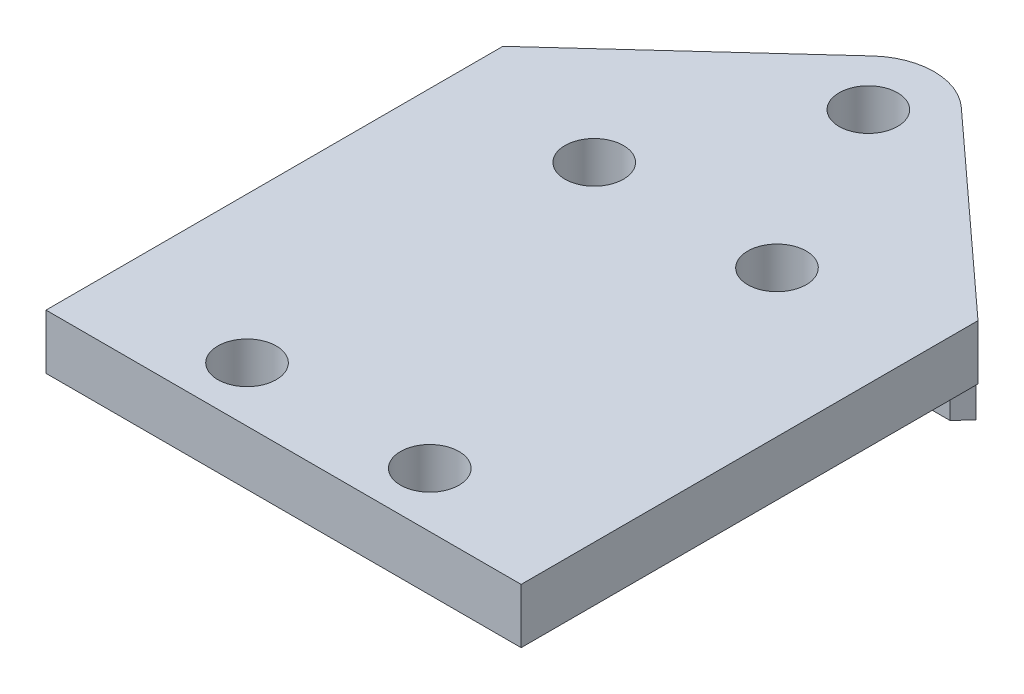
ISO-10303-21;
HEADER;
FILE_DESCRIPTION(('STEP AP214'),'2;1');
FILE_NAME('part.step','',(''),(''),'','','');
FILE_SCHEMA(('AUTOMOTIVE_DESIGN { 1 0 10303 214 1 1 1 1 }'));
ENDSEC;
DATA;
#1=APPLICATION_CONTEXT('core data for automotive mechanical design processes');
#2=APPLICATION_PROTOCOL_DEFINITION('international standard','automotive_design',2000,#1);
#3=PRODUCT_CONTEXT('',#1,'mechanical');
#4=PRODUCT('Part','Part','',(#3));
#5=PRODUCT_RELATED_PRODUCT_CATEGORY('part','',(#4));
#6=PRODUCT_DEFINITION_FORMATION('','',#4);
#7=PRODUCT_DEFINITION_CONTEXT('part definition',#1,'design');
#8=PRODUCT_DEFINITION('design','',#6,#7);
#9=PRODUCT_DEFINITION_SHAPE('','',#8);
#10=(LENGTH_UNIT() NAMED_UNIT(*) SI_UNIT(.MILLI.,.METRE.));
#11=(NAMED_UNIT(*) PLANE_ANGLE_UNIT() SI_UNIT($,.RADIAN.));
#12=(NAMED_UNIT(*) SI_UNIT($,.STERADIAN.) SOLID_ANGLE_UNIT());
#13=UNCERTAINTY_MEASURE_WITH_UNIT(LENGTH_MEASURE(1.E-05),#10,'distance_accuracy_value','');
#14=(GEOMETRIC_REPRESENTATION_CONTEXT(3) GLOBAL_UNCERTAINTY_ASSIGNED_CONTEXT((#13)) GLOBAL_UNIT_ASSIGNED_CONTEXT((#10,
#11,#12)) REPRESENTATION_CONTEXT('',''));
#15=CARTESIAN_POINT('',(0.,0.,0.));
#16=DIRECTION('',(0.,0.,1.));
#17=DIRECTION('',(1.,0.,0.));
#18=AXIS2_PLACEMENT_3D('',#15,#16,#17);
#19=CARTESIAN_POINT('',(13.,0.,-32.));
#20=DIRECTION('',(0.,1.,0.));
#21=DIRECTION('',(0.,0.,1.));
#22=AXIS2_PLACEMENT_3D('',#19,#20,#21);
#23=PLANE('',#22);
#24=CARTESIAN_POINT('',(8.,0.,-3.));
#25=DIRECTION('',(0.,1.,0.));
#26=DIRECTION('',(0.,0.,-1.));
#27=AXIS2_PLACEMENT_3D('',#24,#25,#26);
#28=CIRCLE('',#27,1.6);
#29=CARTESIAN_POINT('',(8.,0.,-4.6));
#30=VERTEX_POINT('',#29);
#31=EDGE_CURVE('E185',#30,#30,#28,.T.);
#32=ORIENTED_EDGE('',*,*,#31,.T.);
#33=EDGE_LOOP('',(#32));
#34=FACE_BOUND('',#33,.T.);
#35=CARTESIAN_POINT('',(18.,0.,-3.));
#36=DIRECTION('',(0.,1.,0.));
#37=DIRECTION('',(0.,0.,1.));
#38=AXIS2_PLACEMENT_3D('',#35,#36,#37);
#39=CIRCLE('',#38,1.6);
#40=CARTESIAN_POINT('',(18.,0.,-1.4));
#41=VERTEX_POINT('',#40);
#42=EDGE_CURVE('E189',#41,#41,#39,.T.);
#43=ORIENTED_EDGE('',*,*,#42,.T.);
#44=EDGE_LOOP('',(#43));
#45=FACE_BOUND('',#44,.T.);
#46=CARTESIAN_POINT('',(18.,0.,-22.));
#47=DIRECTION('',(0.,1.,0.));
#48=DIRECTION('',(0.,0.,-1.));
#49=AXIS2_PLACEMENT_3D('',#46,#47,#48);
#50=CIRCLE('',#49,1.6);
#51=CARTESIAN_POINT('',(18.,0.,-23.6));
#52=VERTEX_POINT('',#51);
#53=EDGE_CURVE('E195',#52,#52,#50,.T.);
#54=ORIENTED_EDGE('',*,*,#53,.T.);
#55=EDGE_LOOP('',(#54));
#56=FACE_BOUND('',#55,.T.);
#57=CARTESIAN_POINT('',(8.,0.,-22.));
#58=DIRECTION('',(0.,1.,0.));
#59=DIRECTION('',(0.,0.,1.));
#60=AXIS2_PLACEMENT_3D('',#57,#58,#59);
#61=CIRCLE('',#60,1.6);
#62=CARTESIAN_POINT('',(8.,0.,-20.4));
#63=VERTEX_POINT('',#62);
#64=EDGE_CURVE('E201',#63,#63,#61,.T.);
#65=ORIENTED_EDGE('',*,*,#64,.T.);
#66=EDGE_LOOP('',(#65));
#67=FACE_BOUND('',#66,.T.);
#68=DIRECTION('',(-0.674470298119938,0.,-0.738301982222723));
#69=VECTOR('',#68,1.);
#70=CARTESIAN_POINT('',(1.35549454233017,0.,-26.2383019822227));
#71=LINE('',#70,#69);
#72=CARTESIAN_POINT('',(2.0299648404501,0.,-25.5));
#73=VERTEX_POINT('',#72);
#74=CARTESIAN_POINT('',(1.35549454233017,0.,-26.2383019822227));
#75=VERTEX_POINT('',#74);
#76=EDGE_CURVE('E58',#73,#75,#71,.T.);
#77=ORIENTED_EDGE('',*,*,#76,.F.);
#78=DIRECTION('',(-1.,0.,0.));
#79=VECTOR('',#78,1.);
#80=CARTESIAN_POINT('',(2.0299648404501,0.,-25.5));
#81=LINE('',#80,#79);
#82=CARTESIAN_POINT('',(23.9700351595499,0.,-25.5));
#83=VERTEX_POINT('',#82);
#84=EDGE_CURVE('E153',#83,#73,#81,.T.);
#85=ORIENTED_EDGE('',*,*,#84,.F.);
#86=DIRECTION('',(-0.674470298119936,0.,0.738301982222725));
#87=VECTOR('',#86,1.);
#88=CARTESIAN_POINT('',(24.6445054576698,0.,-26.2383019822227));
#89=LINE('',#88,#87);
#90=CARTESIAN_POINT('',(24.6445054576698,0.,-26.2383019822227));
#91=VERTEX_POINT('',#90);
#92=EDGE_CURVE('E149',#91,#83,#89,.T.);
#93=ORIENTED_EDGE('',*,*,#92,.F.);
#94=DIRECTION('',(-0.738301982222729,0.,-0.674470298119931));
#95=VECTOR('',#94,1.);
#96=CARTESIAN_POINT('',(26.,0.,-25.));
#97=LINE('',#96,#95);
#98=CARTESIAN_POINT('',(26.,0.,-25.));
#99=VERTEX_POINT('',#98);
#100=EDGE_CURVE('E231',#99,#91,#97,.T.);
#101=ORIENTED_EDGE('',*,*,#100,.F.);
#102=DIRECTION('',(0.,0.,-1.));
#103=VECTOR('',#102,1.);
#104=CARTESIAN_POINT('',(26.,0.,0.));
#105=LINE('',#104,#103);
#106=CARTESIAN_POINT('',(26.,0.,0.));
#107=VERTEX_POINT('',#106);
#108=EDGE_CURVE('E229',#107,#99,#105,.T.);
#109=ORIENTED_EDGE('',*,*,#108,.F.);
#110=DIRECTION('',(1.,0.,0.));
#111=VECTOR('',#110,1.);
#112=CARTESIAN_POINT('',(0.,0.,0.));
#113=LINE('',#112,#111);
#114=CARTESIAN_POINT('',(0.,0.,0.));
#115=VERTEX_POINT('',#114);
#116=EDGE_CURVE('E227',#115,#107,#113,.T.);
#117=ORIENTED_EDGE('',*,*,#116,.F.);
#118=DIRECTION('',(0.,0.,1.));
#119=VECTOR('',#118,1.);
#120=CARTESIAN_POINT('',(0.,0.,0.));
#121=LINE('',#120,#119);
#122=CARTESIAN_POINT('',(0.,0.,-25.));
#123=VERTEX_POINT('',#122);
#124=EDGE_CURVE('E207',#123,#115,#121,.T.);
#125=ORIENTED_EDGE('',*,*,#124,.F.);
#126=DIRECTION('',(-0.738301982222729,0.,0.674470298119931));
#127=VECTOR('',#126,1.);
#128=CARTESIAN_POINT('',(0.,0.,-25.));
#129=LINE('',#128,#127);
#130=EDGE_CURVE('E214',#75,#123,#129,.T.);
#131=ORIENTED_EDGE('',*,*,#130,.F.);
#132=EDGE_LOOP('',(#77,#85,#93,#101,#109,#117,#125,#131));
#133=FACE_BOUND('',#132,.T.);
#134=ADVANCED_FACE('F35',(#34,#45,#56,#67,#133),#23,.F.);
#135=CARTESIAN_POINT('',(13.,3.,-32.));
#136=DIRECTION('',(0.,1.,0.));
#137=DIRECTION('',(0.,0.,1.));
#138=AXIS2_PLACEMENT_3D('',#135,#136,#137);
#139=PLANE('',#138);
#140=CARTESIAN_POINT('',(8.,3.,-3.));
#141=DIRECTION('',(0.,1.,0.));
#142=DIRECTION('',(0.,0.,-1.));
#143=AXIS2_PLACEMENT_3D('',#140,#141,#142);
#144=CIRCLE('',#143,1.6);
#145=CARTESIAN_POINT('',(8.,3.,-4.6));
#146=VERTEX_POINT('',#145);
#147=EDGE_CURVE('E186',#146,#146,#144,.T.);
#148=ORIENTED_EDGE('',*,*,#147,.F.);
#149=EDGE_LOOP('',(#148));
#150=FACE_BOUND('',#149,.T.);
#151=CARTESIAN_POINT('',(18.,3.,-22.));
#152=DIRECTION('',(0.,1.,0.));
#153=DIRECTION('',(0.,0.,-1.));
#154=AXIS2_PLACEMENT_3D('',#151,#152,#153);
#155=CIRCLE('',#154,1.6);
#156=CARTESIAN_POINT('',(18.,3.,-23.6));
#157=VERTEX_POINT('',#156);
#158=EDGE_CURVE('E198',#157,#157,#155,.T.);
#159=ORIENTED_EDGE('',*,*,#158,.F.);
#160=EDGE_LOOP('',(#159));
#161=FACE_BOUND('',#160,.T.);
#162=DIRECTION('',(0.,0.,1.));
#163=VECTOR('',#162,1.);
#164=CARTESIAN_POINT('',(0.,3.,0.));
#165=LINE('',#164,#163);
#166=CARTESIAN_POINT('',(0.,3.,-25.));
#167=VERTEX_POINT('',#166);
#168=CARTESIAN_POINT('',(0.,3.,0.));
#169=VERTEX_POINT('',#168);
#170=EDGE_CURVE('E210',#167,#169,#165,.T.);
#171=ORIENTED_EDGE('',*,*,#170,.T.);
#172=DIRECTION('',(1.,0.,0.));
#173=VECTOR('',#172,1.);
#174=CARTESIAN_POINT('',(0.,3.,0.));
#175=LINE('',#174,#173);
#176=CARTESIAN_POINT('',(26.,3.,0.));
#177=VERTEX_POINT('',#176);
#178=EDGE_CURVE('E213',#169,#177,#175,.T.);
#179=ORIENTED_EDGE('',*,*,#178,.T.);
#180=DIRECTION('',(0.,0.,-1.));
#181=VECTOR('',#180,1.);
#182=CARTESIAN_POINT('',(26.,3.,0.));
#183=LINE('',#182,#181);
#184=CARTESIAN_POINT('',(26.,3.,-25.));
#185=VERTEX_POINT('',#184);
#186=EDGE_CURVE('E216',#177,#185,#183,.T.);
#187=ORIENTED_EDGE('',*,*,#186,.T.);
#188=DIRECTION('',(-0.738301982222729,0.,-0.674470298119931));
#189=VECTOR('',#188,1.);
#190=CARTESIAN_POINT('',(26.,3.,-25.));
#191=LINE('',#190,#189);
#192=CARTESIAN_POINT('',(15.4280930732318,3.,-34.6578871360018));
#193=VERTEX_POINT('',#192);
#194=EDGE_CURVE('E218',#185,#193,#191,.T.);
#195=ORIENTED_EDGE('',*,*,#194,.T.);
#196=CARTESIAN_POINT('',(13.,3.,-32.));
#197=DIRECTION('',(0.,1.,0.));
#198=DIRECTION('',(0.,0.,1.));
#199=AXIS2_PLACEMENT_3D('',#196,#197,#198);
#200=CIRCLE('',#199,3.6);
#201=CARTESIAN_POINT('',(10.5719069267683,3.,-34.6578871360018));
#202=VERTEX_POINT('',#201);
#203=EDGE_CURVE('E220',#193,#202,#200,.T.);
#204=ORIENTED_EDGE('',*,*,#203,.T.);
#205=DIRECTION('',(-0.738301982222729,0.,0.674470298119931));
#206=VECTOR('',#205,1.);
#207=CARTESIAN_POINT('',(0.,3.,-25.));
#208=LINE('',#207,#206);
#209=EDGE_CURVE('E222',#202,#167,#208,.T.);
#210=ORIENTED_EDGE('',*,*,#209,.T.);
#211=EDGE_LOOP('',(#171,#179,#187,#195,#204,#210));
#212=FACE_BOUND('',#211,.T.);
#213=CARTESIAN_POINT('',(8.,3.,-22.));
#214=DIRECTION('',(0.,1.,0.));
#215=DIRECTION('',(0.,0.,1.));
#216=AXIS2_PLACEMENT_3D('',#213,#214,#215);
#217=CIRCLE('',#216,1.6);
#218=CARTESIAN_POINT('',(8.,3.,-20.4));
#219=VERTEX_POINT('',#218);
#220=EDGE_CURVE('E204',#219,#219,#217,.T.);
#221=ORIENTED_EDGE('',*,*,#220,.F.);
#222=EDGE_LOOP('',(#221));
#223=FACE_BOUND('',#222,.T.);
#224=CARTESIAN_POINT('',(18.,3.,-3.));
#225=DIRECTION('',(0.,1.,0.));
#226=DIRECTION('',(0.,0.,1.));
#227=AXIS2_PLACEMENT_3D('',#224,#225,#226);
#228=CIRCLE('',#227,1.6);
#229=CARTESIAN_POINT('',(18.,3.,-1.4));
#230=VERTEX_POINT('',#229);
#231=EDGE_CURVE('E192',#230,#230,#228,.T.);
#232=ORIENTED_EDGE('',*,*,#231,.F.);
#233=EDGE_LOOP('',(#232));
#234=FACE_BOUND('',#233,.T.);
#235=CARTESIAN_POINT('',(13.,3.,-32.));
#236=DIRECTION('',(0.,1.,0.));
#237=DIRECTION('',(0.,0.,1.));
#238=AXIS2_PLACEMENT_3D('',#235,#236,#237);
#239=CIRCLE('',#238,1.6);
#240=CARTESIAN_POINT('',(13.,3.,-30.4));
#241=VERTEX_POINT('',#240);
#242=EDGE_CURVE('E182',#241,#241,#239,.T.);
#243=ORIENTED_EDGE('',*,*,#242,.F.);
#244=EDGE_LOOP('',(#243));
#245=FACE_BOUND('',#244,.T.);
#246=ADVANCED_FACE('F285',(#150,#161,#212,#223,#234,#245),#139,.T.);
#247=CARTESIAN_POINT('',(0.,3.,0.));
#248=DIRECTION('',(1.,0.,0.));
#249=DIRECTION('',(0.,0.,-1.));
#250=AXIS2_PLACEMENT_3D('',#247,#248,#249);
#251=PLANE('',#250);
#252=ORIENTED_EDGE('',*,*,#124,.T.);
#253=DIRECTION('',(0.,-1.,0.));
#254=VECTOR('',#253,1.);
#255=CARTESIAN_POINT('',(0.,3.,0.));
#256=LINE('',#255,#254);
#257=EDGE_CURVE('E11',#169,#115,#256,.T.);
#258=ORIENTED_EDGE('',*,*,#257,.F.);
#259=ORIENTED_EDGE('',*,*,#170,.F.);
#260=DIRECTION('',(0.,-1.,0.));
#261=VECTOR('',#260,1.);
#262=CARTESIAN_POINT('',(0.,3.,-25.));
#263=LINE('',#262,#261);
#264=EDGE_CURVE('E224',#167,#123,#263,.T.);
#265=ORIENTED_EDGE('',*,*,#264,.T.);
#266=EDGE_LOOP('',(#252,#258,#259,#265));
#267=FACE_BOUND('',#266,.T.);
#268=ADVANCED_FACE('F37',(#267),#251,.F.);
#269=CARTESIAN_POINT('',(0.,3.,0.));
#270=DIRECTION('',(0.,0.,-1.));
#271=DIRECTION('',(-1.,0.,0.));
#272=AXIS2_PLACEMENT_3D('',#269,#270,#271);
#273=PLANE('',#272);
#274=ORIENTED_EDGE('',*,*,#116,.T.);
#275=DIRECTION('',(0.,-1.,0.));
#276=VECTOR('',#275,1.);
#277=CARTESIAN_POINT('',(26.,3.,0.));
#278=LINE('',#277,#276);
#279=EDGE_CURVE('E43',#177,#107,#278,.T.);
#280=ORIENTED_EDGE('',*,*,#279,.F.);
#281=ORIENTED_EDGE('',*,*,#178,.F.);
#282=ORIENTED_EDGE('',*,*,#257,.T.);
#283=EDGE_LOOP('',(#274,#280,#281,#282));
#284=FACE_BOUND('',#283,.T.);
#285=ADVANCED_FACE('F306',(#284),#273,.F.);
#286=CARTESIAN_POINT('',(26.,3.,0.));
#287=DIRECTION('',(-1.,0.,0.));
#288=DIRECTION('',(0.,0.,1.));
#289=AXIS2_PLACEMENT_3D('',#286,#287,#288);
#290=PLANE('',#289);
#291=ORIENTED_EDGE('',*,*,#108,.T.);
#292=DIRECTION('',(0.,-1.,0.));
#293=VECTOR('',#292,1.);
#294=CARTESIAN_POINT('',(26.,3.,-25.));
#295=LINE('',#294,#293);
#296=EDGE_CURVE('E240',#185,#99,#295,.T.);
#297=ORIENTED_EDGE('',*,*,#296,.F.);
#298=ORIENTED_EDGE('',*,*,#186,.F.);
#299=ORIENTED_EDGE('',*,*,#279,.T.);
#300=EDGE_LOOP('',(#291,#297,#298,#299));
#301=FACE_BOUND('',#300,.T.);
#302=ADVANCED_FACE('F247',(#301),#290,.F.);
#303=CARTESIAN_POINT('',(26.,3.,-25.));
#304=DIRECTION('',(-0.674470298119931,0.,0.738301982222729));
#305=DIRECTION('',(0.738301982222729,0.,0.674470298119931));
#306=AXIS2_PLACEMENT_3D('',#303,#304,#305);
#307=PLANE('',#306);
#308=ORIENTED_EDGE('',*,*,#100,.T.);
#309=DIRECTION('',(0.,1.,0.));
#310=VECTOR('',#309,1.);
#311=CARTESIAN_POINT('',(24.6445054576698,-3.,-26.2383019822227));
#312=LINE('',#311,#310);
#313=CARTESIAN_POINT('',(24.6445054576698,-3.,-26.2383019822227));
#314=VERTEX_POINT('',#313);
#315=EDGE_CURVE('E179',#314,#91,#312,.T.);
#316=ORIENTED_EDGE('',*,*,#315,.F.);
#317=DIRECTION('',(0.738301982222729,0.,0.674470298119931));
#318=VECTOR('',#317,1.);
#319=CARTESIAN_POINT('',(24.6445054576698,-3.,-26.2383019822227));
#320=LINE('',#319,#318);
#321=CARTESIAN_POINT('',(16.3262761999336,-3.,-33.8373586045612));
#322=VERTEX_POINT('',#321);
#323=EDGE_CURVE('E158',#322,#314,#320,.T.);
#324=ORIENTED_EDGE('',*,*,#323,.F.);
#325=DIRECTION('',(0.,1.,0.));
#326=VECTOR('',#325,1.);
#327=CARTESIAN_POINT('',(16.3262761999336,-8.,-33.8373586045612));
#328=LINE('',#327,#326);
#329=CARTESIAN_POINT('',(16.3262761999336,-8.,-33.8373586045612));
#330=VERTEX_POINT('',#329);
#331=EDGE_CURVE('E150',#330,#322,#328,.T.);
#332=ORIENTED_EDGE('',*,*,#331,.F.);
#333=DIRECTION('',(0.73830198222273,0.,0.67447029811993));
#334=VECTOR('',#333,1.);
#335=CARTESIAN_POINT('',(15.4280930732318,-8.,-34.6578871360018));
#336=LINE('',#335,#334);
#337=CARTESIAN_POINT('',(15.4280930732318,-8.,-34.6578871360018));
#338=VERTEX_POINT('',#337);
#339=EDGE_CURVE('E143',#338,#330,#336,.T.);
#340=ORIENTED_EDGE('',*,*,#339,.F.);
#341=DIRECTION('',(0.,-1.,0.));
#342=VECTOR('',#341,1.);
#343=CARTESIAN_POINT('',(15.4280930732318,3.,-34.6578871360018));
#344=LINE('',#343,#342);
#345=EDGE_CURVE('E238',#193,#338,#344,.T.);
#346=ORIENTED_EDGE('',*,*,#345,.F.);
#347=ORIENTED_EDGE('',*,*,#194,.F.);
#348=ORIENTED_EDGE('',*,*,#296,.T.);
#349=EDGE_LOOP('',(#308,#316,#324,#332,#340,#346,#347,#348));
#350=FACE_BOUND('',#349,.T.);
#351=ADVANCED_FACE('F254',(#350),#307,.F.);
#352=CARTESIAN_POINT('',(13.,3.,-32.));
#353=DIRECTION('',(0.,-1.,0.));
#354=DIRECTION('',(0.,0.,-1.));
#355=AXIS2_PLACEMENT_3D('',#352,#353,#354);
#356=CYLINDRICAL_SURFACE('',#355,3.6);
#357=ORIENTED_EDGE('',*,*,#345,.T.);
#358=CARTESIAN_POINT('',(13.,-8.,-32.));
#359=DIRECTION('',(0.,-1.,0.));
#360=DIRECTION('',(0.,0.,-1.));
#361=AXIS2_PLACEMENT_3D('',#358,#359,#360);
#362=CIRCLE('',#361,3.6);
#363=CARTESIAN_POINT('',(10.5719069267683,-8.,-34.6578871360018));
#364=VERTEX_POINT('',#363);
#365=EDGE_CURVE('E136',#364,#338,#362,.T.);
#366=ORIENTED_EDGE('',*,*,#365,.F.);
#367=DIRECTION('',(0.,-1.,0.));
#368=VECTOR('',#367,1.);
#369=CARTESIAN_POINT('',(10.5719069267683,3.,-34.6578871360018));
#370=LINE('',#369,#368);
#371=EDGE_CURVE('E132',#202,#364,#370,.T.);
#372=ORIENTED_EDGE('',*,*,#371,.F.);
#373=ORIENTED_EDGE('',*,*,#203,.F.);
#374=EDGE_LOOP('',(#357,#366,#372,#373));
#375=FACE_BOUND('',#374,.T.);
#376=ADVANCED_FACE('F299',(#375),#356,.T.);
#377=CARTESIAN_POINT('',(0.,3.,-25.));
#378=DIRECTION('',(0.674470298119931,0.,0.738301982222729));
#379=DIRECTION('',(0.738301982222729,0.,-0.674470298119931));
#380=AXIS2_PLACEMENT_3D('',#377,#378,#379);
#381=PLANE('',#380);
#382=ORIENTED_EDGE('',*,*,#371,.T.);
#383=DIRECTION('',(0.738301982222734,0.,-0.674470298119926));
#384=VECTOR('',#383,1.);
#385=CARTESIAN_POINT('',(9.67372380006639,-8.,-33.8373586045612));
#386=LINE('',#385,#384);
#387=CARTESIAN_POINT('',(9.67372380006639,-8.,-33.8373586045612));
#388=VERTEX_POINT('',#387);
#389=EDGE_CURVE('E124',#388,#364,#386,.T.);
#390=ORIENTED_EDGE('',*,*,#389,.F.);
#391=DIRECTION('',(0.,1.,0.));
#392=VECTOR('',#391,1.);
#393=CARTESIAN_POINT('',(9.67372380006639,-8.,-33.8373586045612));
#394=LINE('',#393,#392);
#395=CARTESIAN_POINT('',(9.67372380006639,-3.,-33.8373586045612));
#396=VERTEX_POINT('',#395);
#397=EDGE_CURVE('E129',#388,#396,#394,.T.);
#398=ORIENTED_EDGE('',*,*,#397,.T.);
#399=DIRECTION('',(0.738301982222729,0.,-0.674470298119931));
#400=VECTOR('',#399,1.);
#401=CARTESIAN_POINT('',(10.5719069267683,-3.,-34.6578871360018));
#402=LINE('',#401,#400);
#403=CARTESIAN_POINT('',(1.35549454233017,-3.,-26.2383019822227));
#404=VERTEX_POINT('',#403);
#405=EDGE_CURVE('E166',#404,#396,#402,.T.);
#406=ORIENTED_EDGE('',*,*,#405,.F.);
#407=DIRECTION('',(0.,1.,0.));
#408=VECTOR('',#407,1.);
#409=CARTESIAN_POINT('',(1.35549454233017,-3.,-26.2383019822227));
#410=LINE('',#409,#408);
#411=EDGE_CURVE('E167',#404,#75,#410,.T.);
#412=ORIENTED_EDGE('',*,*,#411,.T.);
#413=ORIENTED_EDGE('',*,*,#130,.T.);
#414=ORIENTED_EDGE('',*,*,#264,.F.);
#415=ORIENTED_EDGE('',*,*,#209,.F.);
#416=EDGE_LOOP('',(#382,#390,#398,#406,#412,#413,#414,#415));
#417=FACE_BOUND('',#416,.T.);
#418=ADVANCED_FACE('F126',(#417),#381,.F.);
#419=CARTESIAN_POINT('',(8.,3.,-22.));
#420=DIRECTION('',(0.,-1.,0.));
#421=DIRECTION('',(0.,0.,-1.));
#422=AXIS2_PLACEMENT_3D('',#419,#420,#421);
#423=CYLINDRICAL_SURFACE('',#422,1.6);
#424=ORIENTED_EDGE('',*,*,#220,.T.);
#425=EDGE_LOOP('',(#424));
#426=FACE_BOUND('',#425,.T.);
#427=ORIENTED_EDGE('',*,*,#64,.F.);
#428=EDGE_LOOP('',(#427));
#429=FACE_BOUND('',#428,.T.);
#430=ADVANCED_FACE('F298',(#426,#429),#423,.F.);
#431=CARTESIAN_POINT('',(18.,3.,-22.));
#432=DIRECTION('',(0.,-1.,0.));
#433=DIRECTION('',(0.,0.,-1.));
#434=AXIS2_PLACEMENT_3D('',#431,#432,#433);
#435=CYLINDRICAL_SURFACE('',#434,1.6);
#436=ORIENTED_EDGE('',*,*,#158,.T.);
#437=EDGE_LOOP('',(#436));
#438=FACE_BOUND('',#437,.T.);
#439=ORIENTED_EDGE('',*,*,#53,.F.);
#440=EDGE_LOOP('',(#439));
#441=FACE_BOUND('',#440,.T.);
#442=ADVANCED_FACE('F336',(#438,#441),#435,.F.);
#443=CARTESIAN_POINT('',(18.,3.,-3.));
#444=DIRECTION('',(0.,-1.,0.));
#445=DIRECTION('',(0.,0.,-1.));
#446=AXIS2_PLACEMENT_3D('',#443,#444,#445);
#447=CYLINDRICAL_SURFACE('',#446,1.6);
#448=ORIENTED_EDGE('',*,*,#231,.T.);
#449=EDGE_LOOP('',(#448));
#450=FACE_BOUND('',#449,.T.);
#451=ORIENTED_EDGE('',*,*,#42,.F.);
#452=EDGE_LOOP('',(#451));
#453=FACE_BOUND('',#452,.T.);
#454=ADVANCED_FACE('F332',(#450,#453),#447,.F.);
#455=CARTESIAN_POINT('',(8.,3.,-3.));
#456=DIRECTION('',(0.,-1.,0.));
#457=DIRECTION('',(0.,0.,-1.));
#458=AXIS2_PLACEMENT_3D('',#455,#456,#457);
#459=CYLINDRICAL_SURFACE('',#458,1.6);
#460=ORIENTED_EDGE('',*,*,#147,.T.);
#461=EDGE_LOOP('',(#460));
#462=FACE_BOUND('',#461,.T.);
#463=ORIENTED_EDGE('',*,*,#31,.F.);
#464=EDGE_LOOP('',(#463));
#465=FACE_BOUND('',#464,.T.);
#466=ADVANCED_FACE('F328',(#462,#465),#459,.F.);
#467=CARTESIAN_POINT('',(13.,3.,-32.));
#468=DIRECTION('',(0.,-1.,0.));
#469=DIRECTION('',(0.,0.,-1.));
#470=AXIS2_PLACEMENT_3D('',#467,#468,#469);
#471=CYLINDRICAL_SURFACE('',#470,1.6);
#472=ORIENTED_EDGE('',*,*,#242,.T.);
#473=EDGE_LOOP('',(#472));
#474=FACE_BOUND('',#473,.T.);
#475=CARTESIAN_POINT('',(13.,-8.,-32.));
#476=DIRECTION('',(0.,-1.,0.));
#477=DIRECTION('',(0.,0.,-1.));
#478=AXIS2_PLACEMENT_3D('',#475,#476,#477);
#479=CIRCLE('',#478,1.6);
#480=CARTESIAN_POINT('',(13.,-8.,-33.6));
#481=VERTEX_POINT('',#480);
#482=EDGE_CURVE('E267',#481,#481,#479,.T.);
#483=ORIENTED_EDGE('',*,*,#482,.T.);
#484=EDGE_LOOP('',(#483));
#485=FACE_BOUND('',#484,.T.);
#486=ADVANCED_FACE('F272',(#474,#485),#471,.F.);
#487=CARTESIAN_POINT('',(13.,-3.,-32.));
#488=DIRECTION('',(0.,-1.,0.));
#489=DIRECTION('',(0.,0.,-1.));
#490=AXIS2_PLACEMENT_3D('',#487,#488,#489);
#491=PLANE('',#490);
#492=CARTESIAN_POINT('',(13.,-3.,-32.));
#493=DIRECTION('',(0.,-1.,0.));
#494=DIRECTION('',(0.,0.,-1.));
#495=AXIS2_PLACEMENT_3D('',#492,#493,#494);
#496=CIRCLE('',#495,3.80000000000001);
#497=EDGE_CURVE('E50',#322,#396,#496,.T.);
#498=ORIENTED_EDGE('',*,*,#497,.F.);
#499=ORIENTED_EDGE('',*,*,#323,.T.);
#500=DIRECTION('',(-0.674470298119936,0.,0.738301982222725));
#501=VECTOR('',#500,1.);
#502=CARTESIAN_POINT('',(24.6445054576698,-3.,-26.2383019822227));
#503=LINE('',#502,#501);
#504=CARTESIAN_POINT('',(23.9700351595499,-3.,-25.5));
#505=VERTEX_POINT('',#504);
#506=EDGE_CURVE('E160',#314,#505,#503,.T.);
#507=ORIENTED_EDGE('',*,*,#506,.T.);
#508=DIRECTION('',(-1.,0.,0.));
#509=VECTOR('',#508,1.);
#510=CARTESIAN_POINT('',(2.0299648404501,-3.,-25.5));
#511=LINE('',#510,#509);
#512=CARTESIAN_POINT('',(2.0299648404501,-3.,-25.5));
#513=VERTEX_POINT('',#512);
#514=EDGE_CURVE('E162',#505,#513,#511,.T.);
#515=ORIENTED_EDGE('',*,*,#514,.T.);
#516=DIRECTION('',(-0.674470298119938,0.,-0.738301982222723));
#517=VECTOR('',#516,1.);
#518=CARTESIAN_POINT('',(1.35549454233017,-3.,-26.2383019822227));
#519=LINE('',#518,#517);
#520=EDGE_CURVE('E164',#513,#404,#519,.T.);
#521=ORIENTED_EDGE('',*,*,#520,.T.);
#522=ORIENTED_EDGE('',*,*,#405,.T.);
#523=EDGE_LOOP('',(#498,#499,#507,#515,#521,#522));
#524=FACE_BOUND('',#523,.T.);
#525=ADVANCED_FACE('F261',(#524),#491,.T.);
#526=CARTESIAN_POINT('',(24.6445054576698,-3.,-26.2383019822227));
#527=DIRECTION('',(-0.738301982222725,0.,-0.674470298119936));
#528=DIRECTION('',(-0.674470298119936,0.,0.738301982222725));
#529=AXIS2_PLACEMENT_3D('',#526,#527,#528);
#530=PLANE('',#529);
#531=ORIENTED_EDGE('',*,*,#92,.T.);
#532=DIRECTION('',(0.,1.,0.));
#533=VECTOR('',#532,1.);
#534=CARTESIAN_POINT('',(23.9700351595499,-3.,-25.5));
#535=LINE('',#534,#533);
#536=EDGE_CURVE('E176',#505,#83,#535,.T.);
#537=ORIENTED_EDGE('',*,*,#536,.F.);
#538=ORIENTED_EDGE('',*,*,#506,.F.);
#539=ORIENTED_EDGE('',*,*,#315,.T.);
#540=EDGE_LOOP('',(#531,#537,#538,#539));
#541=FACE_BOUND('',#540,.T.);
#542=ADVANCED_FACE('F258',(#541),#530,.F.);
#543=CARTESIAN_POINT('',(2.0299648404501,-3.,-25.5));
#544=DIRECTION('',(0.,0.,-1.));
#545=DIRECTION('',(-1.,0.,0.));
#546=AXIS2_PLACEMENT_3D('',#543,#544,#545);
#547=PLANE('',#546);
#548=ORIENTED_EDGE('',*,*,#84,.T.);
#549=DIRECTION('',(0.,1.,0.));
#550=VECTOR('',#549,1.);
#551=CARTESIAN_POINT('',(2.0299648404501,-3.,-25.5));
#552=LINE('',#551,#550);
#553=EDGE_CURVE('E173',#513,#73,#552,.T.);
#554=ORIENTED_EDGE('',*,*,#553,.F.);
#555=ORIENTED_EDGE('',*,*,#514,.F.);
#556=ORIENTED_EDGE('',*,*,#536,.T.);
#557=EDGE_LOOP('',(#548,#554,#555,#556));
#558=FACE_BOUND('',#557,.T.);
#559=ADVANCED_FACE('F281',(#558),#547,.F.);
#560=CARTESIAN_POINT('',(1.35549454233017,-3.,-26.2383019822227));
#561=DIRECTION('',(0.738301982222723,0.,-0.674470298119938));
#562=DIRECTION('',(-0.674470298119938,0.,-0.738301982222723));
#563=AXIS2_PLACEMENT_3D('',#560,#561,#562);
#564=PLANE('',#563);
#565=ORIENTED_EDGE('',*,*,#76,.T.);
#566=ORIENTED_EDGE('',*,*,#411,.F.);
#567=ORIENTED_EDGE('',*,*,#520,.F.);
#568=ORIENTED_EDGE('',*,*,#553,.T.);
#569=EDGE_LOOP('',(#565,#566,#567,#568));
#570=FACE_BOUND('',#569,.T.);
#571=ADVANCED_FACE('F274',(#570),#564,.F.);
#572=CARTESIAN_POINT('',(13.,-8.,-32.));
#573=DIRECTION('',(0.,-1.,0.));
#574=DIRECTION('',(0.,0.,-1.));
#575=AXIS2_PLACEMENT_3D('',#572,#573,#574);
#576=PLANE('',#575);
#577=CARTESIAN_POINT('',(13.,-8.,-32.));
#578=DIRECTION('',(0.,-1.,0.));
#579=DIRECTION('',(0.,0.,-1.));
#580=AXIS2_PLACEMENT_3D('',#577,#578,#579);
#581=CIRCLE('',#580,3.8);
#582=EDGE_CURVE('E137',#330,#388,#581,.T.);
#583=ORIENTED_EDGE('',*,*,#582,.T.);
#584=ORIENTED_EDGE('',*,*,#389,.T.);
#585=ORIENTED_EDGE('',*,*,#365,.T.);
#586=ORIENTED_EDGE('',*,*,#339,.T.);
#587=EDGE_LOOP('',(#583,#584,#585,#586));
#588=FACE_BOUND('',#587,.T.);
#589=ORIENTED_EDGE('',*,*,#482,.F.);
#590=EDGE_LOOP('',(#589));
#591=FACE_BOUND('',#590,.T.);
#592=ADVANCED_FACE('F140',(#588,#591),#576,.T.);
#593=CARTESIAN_POINT('',(13.,-8.,-32.));
#594=DIRECTION('',(0.,1.,0.));
#595=DIRECTION('',(0.,0.,1.));
#596=AXIS2_PLACEMENT_3D('',#593,#594,#595);
#597=CYLINDRICAL_SURFACE('',#596,3.80000000000001);
#598=ORIENTED_EDGE('',*,*,#497,.T.);
#599=ORIENTED_EDGE('',*,*,#397,.F.);
#600=ORIENTED_EDGE('',*,*,#582,.F.);
#601=ORIENTED_EDGE('',*,*,#331,.T.);
#602=EDGE_LOOP('',(#598,#599,#600,#601));
#603=FACE_BOUND('',#602,.T.);
#604=ADVANCED_FACE('F148',(#603),#597,.T.);
#605=CLOSED_SHELL('',(#134,#246,#268,#285,#302,#351,#376,#418,#430,#442,#454,#466,#486,#525,
#542,#559,#571,#592,#604));
#606=MANIFOLD_SOLID_BREP('B2',#605);
#607=ADVANCED_BREP_SHAPE_REPRESENTATION('',(#18,#606),#14);
#608=SHAPE_DEFINITION_REPRESENTATION(#9,#607);
ENDSEC;
END-ISO-10303-21;
